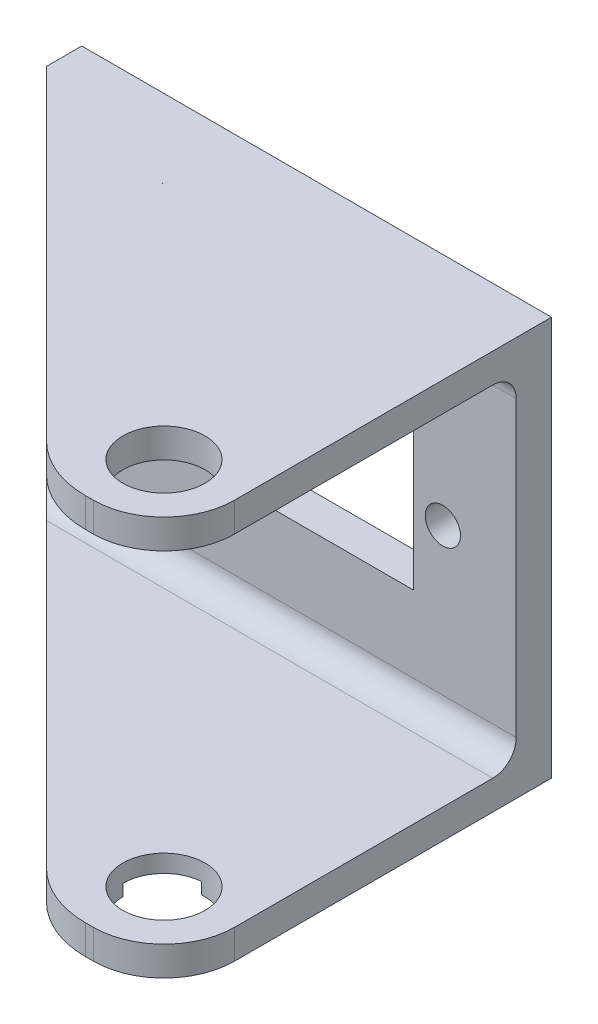
ISO-10303-21;
HEADER;
FILE_DESCRIPTION(('STEP AP214'),'2;1');
FILE_NAME('part.step','',(''),(''),'','','');
FILE_SCHEMA(('AUTOMOTIVE_DESIGN { 1 0 10303 214 1 1 1 1 }'));
ENDSEC;
DATA;
#1=APPLICATION_CONTEXT('core data for automotive mechanical design processes');
#2=APPLICATION_PROTOCOL_DEFINITION('international standard','automotive_design',2000,#1);
#3=PRODUCT_CONTEXT('',#1,'mechanical');
#4=PRODUCT('Part','Part','',(#3));
#5=PRODUCT_RELATED_PRODUCT_CATEGORY('part','',(#4));
#6=PRODUCT_DEFINITION_FORMATION('','',#4);
#7=PRODUCT_DEFINITION_CONTEXT('part definition',#1,'design');
#8=PRODUCT_DEFINITION('design','',#6,#7);
#9=PRODUCT_DEFINITION_SHAPE('','',#8);
#10=(LENGTH_UNIT() NAMED_UNIT(*) SI_UNIT(.MILLI.,.METRE.));
#11=(NAMED_UNIT(*) PLANE_ANGLE_UNIT() SI_UNIT($,.RADIAN.));
#12=(NAMED_UNIT(*) SI_UNIT($,.STERADIAN.) SOLID_ANGLE_UNIT());
#13=UNCERTAINTY_MEASURE_WITH_UNIT(LENGTH_MEASURE(1.E-05),#10,'distance_accuracy_value','');
#14=(GEOMETRIC_REPRESENTATION_CONTEXT(3) GLOBAL_UNCERTAINTY_ASSIGNED_CONTEXT((#13)) GLOBAL_UNIT_ASSIGNED_CONTEXT((#10,
#11,#12)) REPRESENTATION_CONTEXT('',''));
#15=CARTESIAN_POINT('',(0.,0.,0.));
#16=DIRECTION('',(0.,0.,1.));
#17=DIRECTION('',(1.,0.,0.));
#18=AXIS2_PLACEMENT_3D('',#15,#16,#17);
#19=CARTESIAN_POINT('',(0.,0.,3.));
#20=DIRECTION('',(0.,0.,-1.));
#21=DIRECTION('',(-1.,0.,0.));
#22=AXIS2_PLACEMENT_3D('',#19,#20,#21);
#23=PLANE('',#22);
#24=CARTESIAN_POINT('',(11.6483516483516,0.459478021978021,3.));
#25=DIRECTION('',(0.,0.,1.));
#26=DIRECTION('',(1.,0.,0.));
#27=AXIS2_PLACEMENT_3D('',#24,#25,#26);
#28=CIRCLE('',#27,1.5);
#29=CARTESIAN_POINT('',(13.1483516483516,0.459478021978021,3.));
#30=VERTEX_POINT('',#29);
#31=EDGE_CURVE('E349',#30,#30,#28,.T.);
#32=ORIENTED_EDGE('',*,*,#31,.F.);
#33=EDGE_LOOP('',(#32));
#34=FACE_BOUND('',#33,.T.);
#35=CARTESIAN_POINT('',(-15.8516483516484,0.459478021978021,3.));
#36=DIRECTION('',(0.,0.,-1.));
#37=DIRECTION('',(-1.,0.,0.));
#38=AXIS2_PLACEMENT_3D('',#35,#36,#37);
#39=CIRCLE('',#38,1.5);
#40=CARTESIAN_POINT('',(-17.3516483516484,0.459478021978021,3.));
#41=VERTEX_POINT('',#40);
#42=EDGE_CURVE('E355',#41,#41,#39,.T.);
#43=ORIENTED_EDGE('',*,*,#42,.T.);
#44=EDGE_LOOP('',(#43));
#45=FACE_BOUND('',#44,.T.);
#46=DIRECTION('',(1.,0.,0.));
#47=VECTOR('',#46,1.);
#48=CARTESIAN_POINT('',(-13.3516483516484,-5.54052197802198,3.));
#49=LINE('',#48,#47);
#50=CARTESIAN_POINT('',(-13.3516483516484,-5.54052197802198,3.));
#51=VERTEX_POINT('',#50);
#52=CARTESIAN_POINT('',(9.14835164835165,-5.54052197802198,3.));
#53=VERTEX_POINT('',#52);
#54=EDGE_CURVE('E318',#51,#53,#49,.T.);
#55=ORIENTED_EDGE('',*,*,#54,.F.);
#56=DIRECTION('',(0.,-1.,0.));
#57=VECTOR('',#56,1.);
#58=CARTESIAN_POINT('',(-13.3516483516484,6.45947802197802,3.));
#59=LINE('',#58,#57);
#60=CARTESIAN_POINT('',(-13.3516483516484,6.45947802197802,3.));
#61=VERTEX_POINT('',#60);
#62=EDGE_CURVE('E327',#61,#51,#59,.T.);
#63=ORIENTED_EDGE('',*,*,#62,.F.);
#64=DIRECTION('',(1.,0.,0.));
#65=VECTOR('',#64,1.);
#66=CARTESIAN_POINT('',(-13.3516483516484,6.45947802197802,3.));
#67=LINE('',#66,#65);
#68=CARTESIAN_POINT('',(9.14835164835164,6.45947802197802,3.));
#69=VERTEX_POINT('',#68);
#70=EDGE_CURVE('E324',#61,#69,#67,.T.);
#71=ORIENTED_EDGE('',*,*,#70,.T.);
#72=DIRECTION('',(0.,-1.,0.));
#73=VECTOR('',#72,1.);
#74=CARTESIAN_POINT('',(9.14835164835164,6.45947802197802,3.));
#75=LINE('',#74,#73);
#76=EDGE_CURVE('E320',#69,#53,#75,.T.);
#77=ORIENTED_EDGE('',*,*,#76,.T.);
#78=EDGE_LOOP('',(#55,#63,#71,#77));
#79=FACE_BOUND('',#78,.T.);
#80=DIRECTION('',(0.,-1.,0.));
#81=VECTOR('',#80,1.);
#82=CARTESIAN_POINT('',(-22.1016483516484,17.459478021978,3.));
#83=LINE('',#82,#81);
#84=CARTESIAN_POINT('',(-22.1016483516484,12.959478021978,3.));
#85=VERTEX_POINT('',#84);
#86=CARTESIAN_POINT('',(-22.1016483516484,-12.040521978022,3.));
#87=VERTEX_POINT('',#86);
#88=EDGE_CURVE('E364',#85,#87,#83,.T.);
#89=ORIENTED_EDGE('',*,*,#88,.T.);
#90=DIRECTION('',(-1.,0.,0.));
#91=VECTOR('',#90,1.);
#92=CARTESIAN_POINT('',(17.8983516483516,-12.040521978022,3.));
#93=LINE('',#92,#91);
#94=CARTESIAN_POINT('',(17.8983516483516,-12.040521978022,3.));
#95=VERTEX_POINT('',#94);
#96=EDGE_CURVE('E414',#87,#95,#93,.F.);
#97=ORIENTED_EDGE('',*,*,#96,.T.);
#98=DIRECTION('',(0.,-1.,0.));
#99=VECTOR('',#98,1.);
#100=CARTESIAN_POINT('',(17.8983516483516,17.459478021978,3.));
#101=LINE('',#100,#99);
#102=CARTESIAN_POINT('',(17.8983516483516,12.959478021978,3.));
#103=VERTEX_POINT('',#102);
#104=EDGE_CURVE('E361',#103,#95,#101,.T.);
#105=ORIENTED_EDGE('',*,*,#104,.F.);
#106=DIRECTION('',(1.,0.,0.));
#107=VECTOR('',#106,1.);
#108=CARTESIAN_POINT('',(-22.1016483516484,12.959478021978,3.));
#109=LINE('',#108,#107);
#110=EDGE_CURVE('E411',#103,#85,#109,.F.);
#111=ORIENTED_EDGE('',*,*,#110,.T.);
#112=EDGE_LOOP('',(#89,#97,#105,#111));
#113=FACE_BOUND('',#112,.T.);
#114=ADVANCED_FACE('F93',(#34,#45,#79,#113),#23,.F.);
#115=CARTESIAN_POINT('',(0.,0.,0.));
#116=DIRECTION('',(0.,0.,-1.));
#117=DIRECTION('',(-1.,0.,0.));
#118=AXIS2_PLACEMENT_3D('',#115,#116,#117);
#119=PLANE('',#118);
#120=DIRECTION('',(1.,0.,0.));
#121=VECTOR('',#120,1.);
#122=CARTESIAN_POINT('',(-22.1016483516484,-16.540521978022,0.));
#123=LINE('',#122,#121);
#124=CARTESIAN_POINT('',(-22.1016483516484,-16.540521978022,0.));
#125=VERTEX_POINT('',#124);
#126=CARTESIAN_POINT('',(17.8983516483516,-16.540521978022,0.));
#127=VERTEX_POINT('',#126);
#128=EDGE_CURVE('E358',#125,#127,#123,.T.);
#129=ORIENTED_EDGE('',*,*,#128,.F.);
#130=DIRECTION('',(0.,-1.,0.));
#131=VECTOR('',#130,1.);
#132=CARTESIAN_POINT('',(-22.1016483516484,17.459478021978,0.));
#133=LINE('',#132,#131);
#134=CARTESIAN_POINT('',(-22.1016483516484,17.459478021978,0.));
#135=VERTEX_POINT('',#134);
#136=EDGE_CURVE('E365',#135,#125,#133,.T.);
#137=ORIENTED_EDGE('',*,*,#136,.F.);
#138=DIRECTION('',(1.,0.,0.));
#139=VECTOR('',#138,1.);
#140=CARTESIAN_POINT('',(-22.1016483516484,17.459478021978,0.));
#141=LINE('',#140,#139);
#142=CARTESIAN_POINT('',(17.8983516483516,17.459478021978,0.));
#143=VERTEX_POINT('',#142);
#144=EDGE_CURVE('E374',#135,#143,#141,.T.);
#145=ORIENTED_EDGE('',*,*,#144,.T.);
#146=DIRECTION('',(0.,-1.,0.));
#147=VECTOR('',#146,1.);
#148=CARTESIAN_POINT('',(17.8983516483516,17.459478021978,0.));
#149=LINE('',#148,#147);
#150=EDGE_CURVE('E371',#143,#127,#149,.T.);
#151=ORIENTED_EDGE('',*,*,#150,.T.);
#152=EDGE_LOOP('',(#129,#137,#145,#151));
#153=FACE_BOUND('',#152,.T.);
#154=CARTESIAN_POINT('',(-15.8516483516484,0.459478021978021,0.));
#155=DIRECTION('',(0.,0.,-1.));
#156=DIRECTION('',(-1.,0.,0.));
#157=AXIS2_PLACEMENT_3D('',#154,#155,#156);
#158=CIRCLE('',#157,1.5);
#159=CARTESIAN_POINT('',(-17.3516483516484,0.459478021978021,0.));
#160=VERTEX_POINT('',#159);
#161=EDGE_CURVE('E352',#160,#160,#158,.T.);
#162=ORIENTED_EDGE('',*,*,#161,.F.);
#163=EDGE_LOOP('',(#162));
#164=FACE_BOUND('',#163,.T.);
#165=CARTESIAN_POINT('',(11.6483516483516,0.459478021978021,0.));
#166=DIRECTION('',(0.,0.,1.));
#167=DIRECTION('',(1.,0.,0.));
#168=AXIS2_PLACEMENT_3D('',#165,#166,#167);
#169=CIRCLE('',#168,1.5);
#170=CARTESIAN_POINT('',(13.1483516483516,0.459478021978021,0.));
#171=VERTEX_POINT('',#170);
#172=EDGE_CURVE('E348',#171,#171,#169,.T.);
#173=ORIENTED_EDGE('',*,*,#172,.T.);
#174=EDGE_LOOP('',(#173));
#175=FACE_BOUND('',#174,.T.);
#176=DIRECTION('',(0.,-1.,0.));
#177=VECTOR('',#176,1.);
#178=CARTESIAN_POINT('',(-13.3516483516484,6.45947802197802,0.));
#179=LINE('',#178,#177);
#180=CARTESIAN_POINT('',(-13.3516483516484,6.45947802197802,0.));
#181=VERTEX_POINT('',#180);
#182=CARTESIAN_POINT('',(-13.3516483516484,-5.54052197802198,0.));
#183=VERTEX_POINT('',#182);
#184=EDGE_CURVE('E321',#181,#183,#179,.T.);
#185=ORIENTED_EDGE('',*,*,#184,.T.);
#186=DIRECTION('',(1.,0.,0.));
#187=VECTOR('',#186,1.);
#188=CARTESIAN_POINT('',(-13.3516483516484,-5.54052197802198,0.));
#189=LINE('',#188,#187);
#190=CARTESIAN_POINT('',(9.14835164835165,-5.54052197802198,0.));
#191=VERTEX_POINT('',#190);
#192=EDGE_CURVE('E317',#183,#191,#189,.T.);
#193=ORIENTED_EDGE('',*,*,#192,.T.);
#194=DIRECTION('',(0.,-1.,0.));
#195=VECTOR('',#194,1.);
#196=CARTESIAN_POINT('',(9.14835164835164,6.45947802197802,0.));
#197=LINE('',#196,#195);
#198=CARTESIAN_POINT('',(9.14835164835164,6.45947802197802,0.));
#199=VERTEX_POINT('',#198);
#200=EDGE_CURVE('E332',#199,#191,#197,.T.);
#201=ORIENTED_EDGE('',*,*,#200,.F.);
#202=DIRECTION('',(1.,0.,0.));
#203=VECTOR('',#202,1.);
#204=CARTESIAN_POINT('',(-13.3516483516484,6.45947802197802,0.));
#205=LINE('',#204,#203);
#206=EDGE_CURVE('E335',#181,#199,#205,.T.);
#207=ORIENTED_EDGE('',*,*,#206,.F.);
#208=EDGE_LOOP('',(#185,#193,#201,#207));
#209=FACE_BOUND('',#208,.T.);
#210=ADVANCED_FACE('F464',(#153,#164,#175,#209),#119,.T.);
#211=CARTESIAN_POINT('',(-22.1016483516484,-16.540521978022,3.));
#212=DIRECTION('',(0.,1.,0.));
#213=DIRECTION('',(-1.,0.,0.));
#214=AXIS2_PLACEMENT_3D('',#211,#212,#213);
#215=PLANE('',#214);
#216=CARTESIAN_POINT('',(11.8983516483516,-16.540521978022,27.));
#217=DIRECTION('',(0.,1.,0.));
#218=DIRECTION('',(-1.,0.,0.));
#219=AXIS2_PLACEMENT_3D('',#216,#217,#218);
#220=CIRCLE('',#219,3.5);
#221=CARTESIAN_POINT('',(8.39835164835164,-16.540521978022,27.));
#222=VERTEX_POINT('',#221);
#223=CARTESIAN_POINT('',(11.6215659340659,-16.540521978022,23.5109614980102));
#224=VERTEX_POINT('',#223);
#225=EDGE_CURVE('E273',#222,#224,#220,.T.);
#226=ORIENTED_EDGE('',*,*,#225,.T.);
#227=DIRECTION('',(0.703749766299696,0.,0.710447933653919));
#228=VECTOR('',#227,1.);
#229=CARTESIAN_POINT('',(1.21341928070236,-16.540521978022,13.0037519227531));
#230=LINE('',#229,#228);
#231=CARTESIAN_POINT('',(1.21341928070236,-16.540521978022,13.0037519227531));
#232=VERTEX_POINT('',#231);
#233=EDGE_CURVE('E268',#232,#224,#230,.T.);
#234=ORIENTED_EDGE('',*,*,#233,.F.);
#235=DIRECTION('',(0.710447933653919,0.,-0.703749766299696));
#236=VECTOR('',#235,1.);
#237=CARTESIAN_POINT('',(-2.1578948461438,-16.540521978022,16.3432809951912));
#238=LINE('',#237,#236);
#239=CARTESIAN_POINT('',(-2.1578948461438,-16.540521978022,16.3432809951912));
#240=VERTEX_POINT('',#239);
#241=EDGE_CURVE('E769',#240,#232,#238,.T.);
#242=ORIENTED_EDGE('',*,*,#241,.F.);
#243=DIRECTION('',(-0.703749766299696,0.,-0.710447933653919));
#244=VECTOR('',#243,1.);
#245=CARTESIAN_POINT('',(8.39835164835164,-16.540521978022,27.));
#246=LINE('',#245,#244);
#247=EDGE_CURVE('E772',#222,#240,#246,.T.);
#248=ORIENTED_EDGE('',*,*,#247,.F.);
#249=EDGE_LOOP('',(#226,#234,#242,#248));
#250=FACE_BOUND('',#249,.T.);
#251=DIRECTION('',(1.,0.,0.));
#252=VECTOR('',#251,1.);
#253=CARTESIAN_POINT('',(17.8983516483516,-16.540521978022,33.));
#254=LINE('',#253,#252);
#255=CARTESIAN_POINT('',(11.2120601473364,-16.540521978022,33.));
#256=VERTEX_POINT('',#255);
#257=CARTESIAN_POINT('',(11.8983516483516,-16.540521978022,33.));
#258=VERTEX_POINT('',#257);
#259=EDGE_CURVE('E304',#256,#258,#254,.T.);
#260=ORIENTED_EDGE('',*,*,#259,.F.);
#261=CARTESIAN_POINT('',(11.2120601473364,-16.540521978022,25.));
#262=DIRECTION('',(0.,1.,0.));
#263=DIRECTION('',(-1.,0.,0.));
#264=AXIS2_PLACEMENT_3D('',#261,#262,#263);
#265=CIRCLE('',#264,8.);
#266=CARTESIAN_POINT('',(5.55520589784404,-16.540521978022,30.6568542494924));
#267=VERTEX_POINT('',#266);
#268=EDGE_CURVE('E430',#256,#267,#265,.F.);
#269=ORIENTED_EDGE('',*,*,#268,.T.);
#270=DIRECTION('',(-0.707106781186548,0.,-0.707106781186548));
#271=VECTOR('',#270,1.);
#272=CARTESIAN_POINT('',(-22.1016483516484,-16.540521978022,3.));
#273=LINE('',#272,#271);
#274=CARTESIAN_POINT('',(-22.1016483516484,-16.540521978022,3.));
#275=VERTEX_POINT('',#274);
#276=EDGE_CURVE('E294',#267,#275,#273,.T.);
#277=ORIENTED_EDGE('',*,*,#276,.T.);
#278=DIRECTION('',(0.,0.,-1.));
#279=VECTOR('',#278,1.);
#280=CARTESIAN_POINT('',(-22.1016483516484,-16.540521978022,3.));
#281=LINE('',#280,#279);
#282=EDGE_CURVE('E368',#275,#125,#281,.T.);
#283=ORIENTED_EDGE('',*,*,#282,.T.);
#284=ORIENTED_EDGE('',*,*,#128,.T.);
#285=DIRECTION('',(0.,0.,-1.));
#286=VECTOR('',#285,1.);
#287=CARTESIAN_POINT('',(17.8983516483516,-16.540521978022,3.));
#288=LINE('',#287,#286);
#289=CARTESIAN_POINT('',(17.8983516483516,-16.540521978022,27.));
#290=VERTEX_POINT('',#289);
#291=EDGE_CURVE('E384',#290,#127,#288,.T.);
#292=ORIENTED_EDGE('',*,*,#291,.F.);
#293=CARTESIAN_POINT('',(11.8983516483516,-16.540521978022,27.));
#294=DIRECTION('',(0.,1.,0.));
#295=DIRECTION('',(-1.,0.,0.));
#296=AXIS2_PLACEMENT_3D('',#293,#294,#295);
#297=CIRCLE('',#296,6.);
#298=EDGE_CURVE('E405',#290,#258,#297,.F.);
#299=ORIENTED_EDGE('',*,*,#298,.T.);
#300=EDGE_LOOP('',(#260,#269,#277,#283,#284,#292,#299));
#301=FACE_BOUND('',#300,.T.);
#302=ADVANCED_FACE('F470',(#250,#301),#215,.F.);
#303=CARTESIAN_POINT('',(17.8983516483516,17.459478021978,3.));
#304=DIRECTION('',(1.,0.,0.));
#305=DIRECTION('',(0.,1.,0.));
#306=AXIS2_PLACEMENT_3D('',#303,#304,#305);
#307=PLANE('',#306);
#308=DIRECTION('',(0.,0.,-1.));
#309=VECTOR('',#308,1.);
#310=CARTESIAN_POINT('',(17.8983516483516,17.459478021978,3.));
#311=LINE('',#310,#309);
#312=CARTESIAN_POINT('',(17.8983516483516,17.459478021978,27.));
#313=VERTEX_POINT('',#312);
#314=EDGE_CURVE('E382',#313,#143,#311,.T.);
#315=ORIENTED_EDGE('',*,*,#314,.F.);
#316=DIRECTION('',(0.,1.,0.));
#317=VECTOR('',#316,1.);
#318=CARTESIAN_POINT('',(17.8983516483516,17.459478021978,27.));
#319=LINE('',#318,#317);
#320=CARTESIAN_POINT('',(17.8983516483516,14.959478021978,27.));
#321=VERTEX_POINT('',#320);
#322=EDGE_CURVE('E395',#313,#321,#319,.F.);
#323=ORIENTED_EDGE('',*,*,#322,.T.);
#324=DIRECTION('',(0.,0.,-1.));
#325=VECTOR('',#324,1.);
#326=CARTESIAN_POINT('',(17.8983516483516,14.959478021978,33.));
#327=LINE('',#326,#325);
#328=CARTESIAN_POINT('',(17.8983516483516,14.959478021978,5.));
#329=VERTEX_POINT('',#328);
#330=EDGE_CURVE('E314',#321,#329,#327,.T.);
#331=ORIENTED_EDGE('',*,*,#330,.T.);
#332=CARTESIAN_POINT('',(17.8983516483516,12.959478021978,5.));
#333=DIRECTION('',(1.,0.,0.));
#334=DIRECTION('',(0.,1.,0.));
#335=AXIS2_PLACEMENT_3D('',#332,#333,#334);
#336=CIRCLE('',#335,2.);
#337=EDGE_CURVE('E424',#329,#103,#336,.F.);
#338=ORIENTED_EDGE('',*,*,#337,.T.);
#339=ORIENTED_EDGE('',*,*,#104,.T.);
#340=CARTESIAN_POINT('',(17.8983516483516,-12.040521978022,5.));
#341=DIRECTION('',(1.,0.,0.));
#342=DIRECTION('',(0.,1.,0.));
#343=AXIS2_PLACEMENT_3D('',#340,#341,#342);
#344=CIRCLE('',#343,2.);
#345=CARTESIAN_POINT('',(17.8983516483516,-14.040521978022,5.));
#346=VERTEX_POINT('',#345);
#347=EDGE_CURVE('E422',#95,#346,#344,.F.);
#348=ORIENTED_EDGE('',*,*,#347,.T.);
#349=DIRECTION('',(0.,0.,-1.));
#350=VECTOR('',#349,1.);
#351=CARTESIAN_POINT('',(17.8983516483516,-14.040521978022,33.));
#352=LINE('',#351,#350);
#353=CARTESIAN_POINT('',(17.8983516483516,-14.040521978022,27.));
#354=VERTEX_POINT('',#353);
#355=EDGE_CURVE('E306',#354,#346,#352,.T.);
#356=ORIENTED_EDGE('',*,*,#355,.F.);
#357=DIRECTION('',(0.,1.,0.));
#358=VECTOR('',#357,1.);
#359=CARTESIAN_POINT('',(17.8983516483516,-16.540521978022,27.));
#360=LINE('',#359,#358);
#361=EDGE_CURVE('E393',#354,#290,#360,.F.);
#362=ORIENTED_EDGE('',*,*,#361,.T.);
#363=ORIENTED_EDGE('',*,*,#291,.T.);
#364=ORIENTED_EDGE('',*,*,#150,.F.);
#365=EDGE_LOOP('',(#315,#323,#331,#338,#339,#348,#356,#362,#363,#364));
#366=FACE_BOUND('',#365,.T.);
#367=ADVANCED_FACE('F485',(#366),#307,.T.);
#368=CARTESIAN_POINT('',(-22.1016483516484,17.459478021978,3.));
#369=DIRECTION('',(0.,1.,0.));
#370=DIRECTION('',(-1.,0.,0.));
#371=AXIS2_PLACEMENT_3D('',#368,#369,#370);
#372=PLANE('',#371);
#373=DIRECTION('',(0.707106781186547,0.,0.707106781186547));
#374=VECTOR('',#373,1.);
#375=CARTESIAN_POINT('',(-22.1016483516484,17.459478021978,3.));
#376=LINE('',#375,#374);
#377=CARTESIAN_POINT('',(-22.1016483516484,17.459478021978,3.));
#378=VERTEX_POINT('',#377);
#379=CARTESIAN_POINT('',(5.55520589784402,17.459478021978,30.6568542494924));
#380=VERTEX_POINT('',#379);
#381=EDGE_CURVE('E280',#378,#380,#376,.T.);
#382=ORIENTED_EDGE('',*,*,#381,.T.);
#383=CARTESIAN_POINT('',(11.2120601473364,17.459478021978,25.));
#384=DIRECTION('',(0.,1.,0.));
#385=DIRECTION('',(-1.,0.,0.));
#386=AXIS2_PLACEMENT_3D('',#383,#384,#385);
#387=CIRCLE('',#386,8.);
#388=CARTESIAN_POINT('',(11.2120601473364,17.459478021978,33.));
#389=VERTEX_POINT('',#388);
#390=EDGE_CURVE('E12',#380,#389,#387,.T.);
#391=ORIENTED_EDGE('',*,*,#390,.T.);
#392=DIRECTION('',(-1.,0.,0.));
#393=VECTOR('',#392,1.);
#394=CARTESIAN_POINT('',(17.8983516483516,17.459478021978,33.));
#395=LINE('',#394,#393);
#396=CARTESIAN_POINT('',(11.8983516483516,17.459478021978,33.));
#397=VERTEX_POINT('',#396);
#398=EDGE_CURVE('E311',#397,#389,#395,.T.);
#399=ORIENTED_EDGE('',*,*,#398,.F.);
#400=CARTESIAN_POINT('',(11.8983516483516,17.459478021978,27.));
#401=DIRECTION('',(0.,1.,0.));
#402=DIRECTION('',(-1.,0.,0.));
#403=AXIS2_PLACEMENT_3D('',#400,#401,#402);
#404=CIRCLE('',#403,6.);
#405=EDGE_CURVE('E391',#397,#313,#404,.T.);
#406=ORIENTED_EDGE('',*,*,#405,.T.);
#407=ORIENTED_EDGE('',*,*,#314,.T.);
#408=ORIENTED_EDGE('',*,*,#144,.F.);
#409=DIRECTION('',(0.,0.,-1.));
#410=VECTOR('',#409,1.);
#411=CARTESIAN_POINT('',(-22.1016483516484,17.459478021978,3.));
#412=LINE('',#411,#410);
#413=EDGE_CURVE('E380',#378,#135,#412,.T.);
#414=ORIENTED_EDGE('',*,*,#413,.F.);
#415=EDGE_LOOP('',(#382,#391,#399,#406,#407,#408,#414));
#416=FACE_BOUND('',#415,.T.);
#417=CARTESIAN_POINT('',(11.8983516483516,17.459478021978,27.));
#418=DIRECTION('',(0.,-1.,0.));
#419=DIRECTION('',(1.,0.,0.));
#420=AXIS2_PLACEMENT_3D('',#417,#418,#419);
#421=CIRCLE('',#420,3.5);
#422=CARTESIAN_POINT('',(15.3983516483516,17.459478021978,27.));
#423=VERTEX_POINT('',#422);
#424=EDGE_CURVE('E283',#423,#423,#421,.T.);
#425=ORIENTED_EDGE('',*,*,#424,.T.);
#426=EDGE_LOOP('',(#425));
#427=FACE_BOUND('',#426,.T.);
#428=ADVANCED_FACE('F453',(#416,#427),#372,.T.);
#429=CARTESIAN_POINT('',(-22.1016483516484,17.459478021978,3.));
#430=DIRECTION('',(1.,0.,0.));
#431=DIRECTION('',(0.,1.,0.));
#432=AXIS2_PLACEMENT_3D('',#429,#430,#431);
#433=PLANE('',#432);
#434=ORIENTED_EDGE('',*,*,#282,.F.);
#435=DIRECTION('',(0.,-1.,0.));
#436=VECTOR('',#435,1.);
#437=CARTESIAN_POINT('',(-22.1016483516484,17.459478021978,3.));
#438=LINE('',#437,#436);
#439=EDGE_CURVE('E282',#87,#275,#438,.T.);
#440=ORIENTED_EDGE('',*,*,#439,.F.);
#441=ORIENTED_EDGE('',*,*,#88,.F.);
#442=EDGE_CURVE('E284',#378,#85,#438,.T.);
#443=ORIENTED_EDGE('',*,*,#442,.F.);
#444=ORIENTED_EDGE('',*,*,#413,.T.);
#445=ORIENTED_EDGE('',*,*,#136,.T.);
#446=EDGE_LOOP('',(#434,#440,#441,#443,#444,#445));
#447=FACE_BOUND('',#446,.T.);
#448=ADVANCED_FACE('F479',(#447),#433,.F.);
#449=CARTESIAN_POINT('',(-15.8516483516484,0.459478021978021,3.));
#450=DIRECTION('',(0.,0.,-1.));
#451=DIRECTION('',(-1.,0.,0.));
#452=AXIS2_PLACEMENT_3D('',#449,#450,#451);
#453=CYLINDRICAL_SURFACE('',#452,1.5);
#454=ORIENTED_EDGE('',*,*,#42,.F.);
#455=EDGE_LOOP('',(#454));
#456=FACE_BOUND('',#455,.T.);
#457=ORIENTED_EDGE('',*,*,#161,.T.);
#458=EDGE_LOOP('',(#457));
#459=FACE_BOUND('',#458,.T.);
#460=ADVANCED_FACE('F476',(#456,#459),#453,.F.);
#461=CARTESIAN_POINT('',(11.6483516483516,0.459478021978021,3.));
#462=DIRECTION('',(0.,0.,-1.));
#463=DIRECTION('',(-1.,0.,0.));
#464=AXIS2_PLACEMENT_3D('',#461,#462,#463);
#465=CYLINDRICAL_SURFACE('',#464,1.5);
#466=ORIENTED_EDGE('',*,*,#31,.T.);
#467=EDGE_LOOP('',(#466));
#468=FACE_BOUND('',#467,.T.);
#469=ORIENTED_EDGE('',*,*,#172,.F.);
#470=EDGE_LOOP('',(#469));
#471=FACE_BOUND('',#470,.T.);
#472=ADVANCED_FACE('F576',(#468,#471),#465,.F.);
#473=CARTESIAN_POINT('',(-13.3516483516484,-5.54052197802198,3.));
#474=DIRECTION('',(0.,1.,0.));
#475=DIRECTION('',(0.,0.,1.));
#476=AXIS2_PLACEMENT_3D('',#473,#474,#475);
#477=PLANE('',#476);
#478=ORIENTED_EDGE('',*,*,#192,.F.);
#479=DIRECTION('',(0.,0.,-1.));
#480=VECTOR('',#479,1.);
#481=CARTESIAN_POINT('',(-13.3516483516484,-5.54052197802198,3.));
#482=LINE('',#481,#480);
#483=EDGE_CURVE('E329',#51,#183,#482,.T.);
#484=ORIENTED_EDGE('',*,*,#483,.F.);
#485=ORIENTED_EDGE('',*,*,#54,.T.);
#486=DIRECTION('',(0.,0.,-1.));
#487=VECTOR('',#486,1.);
#488=CARTESIAN_POINT('',(9.14835164835165,-5.54052197802198,3.));
#489=LINE('',#488,#487);
#490=EDGE_CURVE('E346',#53,#191,#489,.T.);
#491=ORIENTED_EDGE('',*,*,#490,.T.);
#492=EDGE_LOOP('',(#478,#484,#485,#491));
#493=FACE_BOUND('',#492,.T.);
#494=ADVANCED_FACE('F573',(#493),#477,.T.);
#495=CARTESIAN_POINT('',(9.14835164835164,6.45947802197802,3.));
#496=DIRECTION('',(1.,0.,0.));
#497=DIRECTION('',(0.,1.,0.));
#498=AXIS2_PLACEMENT_3D('',#495,#496,#497);
#499=PLANE('',#498);
#500=ORIENTED_EDGE('',*,*,#200,.T.);
#501=ORIENTED_EDGE('',*,*,#490,.F.);
#502=ORIENTED_EDGE('',*,*,#76,.F.);
#503=DIRECTION('',(0.,0.,-1.));
#504=VECTOR('',#503,1.);
#505=CARTESIAN_POINT('',(9.14835164835164,6.45947802197802,3.));
#506=LINE('',#505,#504);
#507=EDGE_CURVE('E344',#69,#199,#506,.T.);
#508=ORIENTED_EDGE('',*,*,#507,.T.);
#509=EDGE_LOOP('',(#500,#501,#502,#508));
#510=FACE_BOUND('',#509,.T.);
#511=ADVANCED_FACE('F569',(#510),#499,.F.);
#512=CARTESIAN_POINT('',(-13.3516483516484,6.45947802197802,3.));
#513=DIRECTION('',(0.,1.,0.));
#514=DIRECTION('',(0.,0.,1.));
#515=AXIS2_PLACEMENT_3D('',#512,#513,#514);
#516=PLANE('',#515);
#517=ORIENTED_EDGE('',*,*,#206,.T.);
#518=ORIENTED_EDGE('',*,*,#507,.F.);
#519=ORIENTED_EDGE('',*,*,#70,.F.);
#520=DIRECTION('',(0.,0.,-1.));
#521=VECTOR('',#520,1.);
#522=CARTESIAN_POINT('',(-13.3516483516484,6.45947802197802,3.));
#523=LINE('',#522,#521);
#524=EDGE_CURVE('E342',#61,#181,#523,.T.);
#525=ORIENTED_EDGE('',*,*,#524,.T.);
#526=EDGE_LOOP('',(#517,#518,#519,#525));
#527=FACE_BOUND('',#526,.T.);
#528=ADVANCED_FACE('F565',(#527),#516,.F.);
#529=CARTESIAN_POINT('',(-13.3516483516484,6.45947802197802,3.));
#530=DIRECTION('',(1.,0.,0.));
#531=DIRECTION('',(0.,0.,-1.));
#532=AXIS2_PLACEMENT_3D('',#529,#530,#531);
#533=PLANE('',#532);
#534=ORIENTED_EDGE('',*,*,#184,.F.);
#535=ORIENTED_EDGE('',*,*,#524,.F.);
#536=ORIENTED_EDGE('',*,*,#62,.T.);
#537=ORIENTED_EDGE('',*,*,#483,.T.);
#538=EDGE_LOOP('',(#534,#535,#536,#537));
#539=FACE_BOUND('',#538,.T.);
#540=ADVANCED_FACE('F561',(#539),#533,.T.);
#541=CARTESIAN_POINT('',(-22.1016483516484,14.959478021978,33.));
#542=DIRECTION('',(0.,1.,0.));
#543=DIRECTION('',(0.,0.,1.));
#544=AXIS2_PLACEMENT_3D('',#541,#542,#543);
#545=PLANE('',#544);
#546=CARTESIAN_POINT('',(11.8983516483516,14.959478021978,27.));
#547=DIRECTION('',(0.,1.,0.));
#548=DIRECTION('',(0.,0.,1.));
#549=AXIS2_PLACEMENT_3D('',#546,#547,#548);
#550=CIRCLE('',#549,3.5);
#551=CARTESIAN_POINT('',(11.8983516483516,14.959478021978,30.5));
#552=VERTEX_POINT('',#551);
#553=EDGE_CURVE('E297',#552,#552,#550,.T.);
#554=ORIENTED_EDGE('',*,*,#553,.T.);
#555=EDGE_LOOP('',(#554));
#556=FACE_BOUND('',#555,.T.);
#557=DIRECTION('',(1.,0.,0.));
#558=VECTOR('',#557,1.);
#559=CARTESIAN_POINT('',(-22.1016483516484,14.959478021978,33.));
#560=LINE('',#559,#558);
#561=CARTESIAN_POINT('',(11.2120601473364,14.959478021978,33.));
#562=VERTEX_POINT('',#561);
#563=CARTESIAN_POINT('',(11.8983516483516,14.959478021978,33.));
#564=VERTEX_POINT('',#563);
#565=EDGE_CURVE('E309',#562,#564,#560,.T.);
#566=ORIENTED_EDGE('',*,*,#565,.F.);
#567=CARTESIAN_POINT('',(11.2120601473364,14.959478021978,25.));
#568=DIRECTION('',(0.,1.,0.));
#569=DIRECTION('',(0.,0.,1.));
#570=AXIS2_PLACEMENT_3D('',#567,#568,#569);
#571=CIRCLE('',#570,8.);
#572=CARTESIAN_POINT('',(5.55520589784402,14.959478021978,30.6568542494924));
#573=VERTEX_POINT('',#572);
#574=EDGE_CURVE('E115',#562,#573,#571,.F.);
#575=ORIENTED_EDGE('',*,*,#574,.T.);
#576=DIRECTION('',(-0.707106781186548,0.,-0.707106781186548));
#577=VECTOR('',#576,1.);
#578=CARTESIAN_POINT('',(-7.10164835164836,14.959478021978,18.));
#579=LINE('',#578,#577);
#580=CARTESIAN_POINT('',(-20.1016483516484,14.959478021978,5.));
#581=VERTEX_POINT('',#580);
#582=EDGE_CURVE('E292',#573,#581,#579,.T.);
#583=ORIENTED_EDGE('',*,*,#582,.T.);
#584=DIRECTION('',(1.,0.,0.));
#585=VECTOR('',#584,1.);
#586=CARTESIAN_POINT('',(17.8983516483516,14.959478021978,5.));
#587=LINE('',#586,#585);
#588=EDGE_CURVE('E416',#581,#329,#587,.T.);
#589=ORIENTED_EDGE('',*,*,#588,.T.);
#590=ORIENTED_EDGE('',*,*,#330,.F.);
#591=CARTESIAN_POINT('',(11.8983516483516,14.959478021978,27.));
#592=DIRECTION('',(0.,1.,0.));
#593=DIRECTION('',(0.,0.,1.));
#594=AXIS2_PLACEMENT_3D('',#591,#592,#593);
#595=CIRCLE('',#594,6.);
#596=EDGE_CURVE('E397',#321,#564,#595,.F.);
#597=ORIENTED_EDGE('',*,*,#596,.T.);
#598=EDGE_LOOP('',(#566,#575,#583,#589,#590,#597));
#599=FACE_BOUND('',#598,.T.);
#600=ADVANCED_FACE('F445',(#556,#599),#545,.F.);
#601=CARTESIAN_POINT('',(0.,0.,33.));
#602=DIRECTION('',(0.,0.,1.));
#603=DIRECTION('',(1.,0.,0.));
#604=AXIS2_PLACEMENT_3D('',#601,#602,#603);
#605=PLANE('',#604);
#606=ORIENTED_EDGE('',*,*,#398,.T.);
#607=DIRECTION('',(0.,-1.,0.));
#608=VECTOR('',#607,1.);
#609=CARTESIAN_POINT('',(11.2120601473364,14.959478021978,33.));
#610=LINE('',#609,#608);
#611=EDGE_CURVE('E436',#389,#562,#610,.T.);
#612=ORIENTED_EDGE('',*,*,#611,.T.);
#613=ORIENTED_EDGE('',*,*,#565,.T.);
#614=DIRECTION('',(0.,1.,0.));
#615=VECTOR('',#614,1.);
#616=CARTESIAN_POINT('',(11.8983516483516,0.,33.));
#617=LINE('',#616,#615);
#618=EDGE_CURVE('E386',#564,#397,#617,.T.);
#619=ORIENTED_EDGE('',*,*,#618,.T.);
#620=EDGE_LOOP('',(#606,#612,#613,#619));
#621=FACE_BOUND('',#620,.T.);
#622=ADVANCED_FACE('F441',(#621),#605,.T.);
#623=CARTESIAN_POINT('',(-22.1016483516484,-14.040521978022,33.));
#624=DIRECTION('',(0.,-1.,0.));
#625=DIRECTION('',(0.,0.,-1.));
#626=AXIS2_PLACEMENT_3D('',#623,#624,#625);
#627=PLANE('',#626);
#628=CARTESIAN_POINT('',(11.8983516483516,-14.040521978022,27.));
#629=DIRECTION('',(0.,-1.,0.));
#630=DIRECTION('',(0.,0.,-1.));
#631=AXIS2_PLACEMENT_3D('',#628,#629,#630);
#632=CIRCLE('',#631,3.5);
#633=CARTESIAN_POINT('',(11.8983516483516,-14.040521978022,23.5));
#634=VERTEX_POINT('',#633);
#635=EDGE_CURVE('E296',#634,#634,#632,.T.);
#636=ORIENTED_EDGE('',*,*,#635,.T.);
#637=EDGE_LOOP('',(#636));
#638=FACE_BOUND('',#637,.T.);
#639=DIRECTION('',(0.707106781186548,0.,0.707106781186548));
#640=VECTOR('',#639,1.);
#641=CARTESIAN_POINT('',(-7.10164835164836,-14.040521978022,18.));
#642=LINE('',#641,#640);
#643=CARTESIAN_POINT('',(-20.1016483516484,-14.040521978022,5.));
#644=VERTEX_POINT('',#643);
#645=CARTESIAN_POINT('',(5.55520589784402,-14.040521978022,30.6568542494924));
#646=VERTEX_POINT('',#645);
#647=EDGE_CURVE('E286',#644,#646,#642,.T.);
#648=ORIENTED_EDGE('',*,*,#647,.T.);
#649=CARTESIAN_POINT('',(11.2120601473364,-14.040521978022,25.));
#650=DIRECTION('',(0.,-1.,0.));
#651=DIRECTION('',(0.,0.,-1.));
#652=AXIS2_PLACEMENT_3D('',#649,#650,#651);
#653=CIRCLE('',#652,8.);
#654=CARTESIAN_POINT('',(11.2120601473364,-14.040521978022,33.));
#655=VERTEX_POINT('',#654);
#656=EDGE_CURVE('E434',#646,#655,#653,.F.);
#657=ORIENTED_EDGE('',*,*,#656,.T.);
#658=DIRECTION('',(-1.,0.,0.));
#659=VECTOR('',#658,1.);
#660=CARTESIAN_POINT('',(-22.1016483516484,-14.040521978022,33.));
#661=LINE('',#660,#659);
#662=CARTESIAN_POINT('',(11.8983516483517,-14.040521978022,33.));
#663=VERTEX_POINT('',#662);
#664=EDGE_CURVE('E301',#663,#655,#661,.T.);
#665=ORIENTED_EDGE('',*,*,#664,.F.);
#666=CARTESIAN_POINT('',(11.8983516483516,-14.040521978022,27.));
#667=DIRECTION('',(0.,-1.,0.));
#668=DIRECTION('',(0.,0.,-1.));
#669=AXIS2_PLACEMENT_3D('',#666,#667,#668);
#670=CIRCLE('',#669,6.);
#671=EDGE_CURVE('E403',#663,#354,#670,.F.);
#672=ORIENTED_EDGE('',*,*,#671,.T.);
#673=ORIENTED_EDGE('',*,*,#355,.T.);
#674=DIRECTION('',(-1.,0.,0.));
#675=VECTOR('',#674,1.);
#676=CARTESIAN_POINT('',(-22.1016483516484,-14.040521978022,5.));
#677=LINE('',#676,#675);
#678=EDGE_CURVE('E408',#346,#644,#677,.T.);
#679=ORIENTED_EDGE('',*,*,#678,.T.);
#680=EDGE_LOOP('',(#648,#657,#665,#672,#673,#679));
#681=FACE_BOUND('',#680,.T.);
#682=ADVANCED_FACE('F546',(#638,#681),#627,.F.);
#683=CARTESIAN_POINT('',(0.,0.,33.));
#684=DIRECTION('',(0.,0.,-1.));
#685=DIRECTION('',(-1.,0.,0.));
#686=AXIS2_PLACEMENT_3D('',#683,#684,#685);
#687=PLANE('',#686);
#688=ORIENTED_EDGE('',*,*,#664,.T.);
#689=DIRECTION('',(0.,-1.,0.));
#690=VECTOR('',#689,1.);
#691=CARTESIAN_POINT('',(11.2120601473364,0.,33.));
#692=LINE('',#691,#690);
#693=EDGE_CURVE('E257',#655,#256,#692,.T.);
#694=ORIENTED_EDGE('',*,*,#693,.T.);
#695=ORIENTED_EDGE('',*,*,#259,.T.);
#696=DIRECTION('',(0.,1.,0.));
#697=VECTOR('',#696,1.);
#698=CARTESIAN_POINT('',(11.8983516483516,-14.040521978022,33.));
#699=LINE('',#698,#697);
#700=EDGE_CURVE('E400',#258,#663,#699,.T.);
#701=ORIENTED_EDGE('',*,*,#700,.T.);
#702=EDGE_LOOP('',(#688,#694,#695,#701));
#703=FACE_BOUND('',#702,.T.);
#704=ADVANCED_FACE('F542',(#703),#687,.F.);
#705=CARTESIAN_POINT('',(-22.1016483516484,17.459478021978,3.));
#706=DIRECTION('',(0.707106781186547,0.,-0.707106781186547));
#707=DIRECTION('',(-0.707106781186548,0.,-0.707106781186548));
#708=AXIS2_PLACEMENT_3D('',#705,#706,#707);
#709=PLANE('',#708);
#710=ORIENTED_EDGE('',*,*,#276,.F.);
#711=DIRECTION('',(0.,-1.,0.));
#712=VECTOR('',#711,1.);
#713=CARTESIAN_POINT('',(5.55520589784402,17.459478021978,30.6568542494924));
#714=LINE('',#713,#712);
#715=EDGE_CURVE('E432',#267,#646,#714,.F.);
#716=ORIENTED_EDGE('',*,*,#715,.T.);
#717=ORIENTED_EDGE('',*,*,#647,.F.);
#718=CARTESIAN_POINT('',(-20.1016483516484,-12.040521978022,5.));
#719=DIRECTION('',(0.707106781186547,0.,-0.707106781186547));
#720=DIRECTION('',(0.707106781186548,0.,0.707106781186548));
#721=AXIS2_PLACEMENT_3D('',#718,#719,#720);
#722=ELLIPSE('',#721,2.82842712474619,2.);
#723=EDGE_CURVE('E419',#644,#87,#722,.T.);
#724=ORIENTED_EDGE('',*,*,#723,.T.);
#725=ORIENTED_EDGE('',*,*,#439,.T.);
#726=EDGE_LOOP('',(#710,#716,#717,#724,#725));
#727=FACE_BOUND('',#726,.T.);
#728=ADVANCED_FACE('F523',(#727),#709,.F.);
#729=CARTESIAN_POINT('',(11.8983516483516,17.459478021978,27.));
#730=DIRECTION('',(0.,-1.,0.));
#731=DIRECTION('',(1.,0.,0.));
#732=AXIS2_PLACEMENT_3D('',#729,#730,#731);
#733=CYLINDRICAL_SURFACE('',#732,3.5);
#734=ORIENTED_EDGE('',*,*,#635,.F.);
#735=EDGE_LOOP('',(#734));
#736=FACE_BOUND('',#735,.T.);
#737=CARTESIAN_POINT('',(11.8983516483516,-15.540521978022,27.));
#738=DIRECTION('',(0.,-1.,0.));
#739=DIRECTION('',(1.,0.,0.));
#740=AXIS2_PLACEMENT_3D('',#737,#738,#739);
#741=CIRCLE('',#740,3.5);
#742=CARTESIAN_POINT('',(11.6215659340659,-15.540521978022,23.5109614980102));
#743=VERTEX_POINT('',#742);
#744=CARTESIAN_POINT('',(8.39835164835164,-15.540521978022,27.));
#745=VERTEX_POINT('',#744);
#746=EDGE_CURVE('E246',#743,#745,#741,.F.);
#747=ORIENTED_EDGE('',*,*,#746,.F.);
#748=DIRECTION('',(0.,-1.,0.));
#749=VECTOR('',#748,1.);
#750=CARTESIAN_POINT('',(11.6215659340659,-15.540521978022,23.5109614980102));
#751=LINE('',#750,#749);
#752=EDGE_CURVE('E289',#743,#224,#751,.T.);
#753=ORIENTED_EDGE('',*,*,#752,.T.);
#754=ORIENTED_EDGE('',*,*,#225,.F.);
#755=DIRECTION('',(0.,-1.,0.));
#756=VECTOR('',#755,1.);
#757=CARTESIAN_POINT('',(8.39835164835164,-15.540521978022,27.));
#758=LINE('',#757,#756);
#759=EDGE_CURVE('E263',#745,#222,#758,.T.);
#760=ORIENTED_EDGE('',*,*,#759,.F.);
#761=EDGE_LOOP('',(#747,#753,#754,#760));
#762=FACE_BOUND('',#761,.T.);
#763=ADVANCED_FACE('F271',(#736,#762),#733,.F.);
#764=ORIENTED_EDGE('',*,*,#582,.F.);
#765=DIRECTION('',(0.,-1.,0.));
#766=VECTOR('',#765,1.);
#767=CARTESIAN_POINT('',(5.55520589784402,17.459478021978,30.6568542494924));
#768=LINE('',#767,#766);
#769=EDGE_CURVE('E101',#573,#380,#768,.F.);
#770=ORIENTED_EDGE('',*,*,#769,.T.);
#771=ORIENTED_EDGE('',*,*,#381,.F.);
#772=ORIENTED_EDGE('',*,*,#442,.T.);
#773=CARTESIAN_POINT('',(-20.1016483516484,12.959478021978,5.));
#774=DIRECTION('',(0.707106781186547,0.,-0.707106781186547));
#775=DIRECTION('',(-0.707106781186548,0.,-0.707106781186548));
#776=AXIS2_PLACEMENT_3D('',#773,#774,#775);
#777=ELLIPSE('',#776,2.82842712474619,2.);
#778=EDGE_CURVE('E258',#85,#581,#777,.T.);
#779=ORIENTED_EDGE('',*,*,#778,.T.);
#780=EDGE_LOOP('',(#764,#770,#771,#772,#779));
#781=FACE_BOUND('',#780,.T.);
#782=ADVANCED_FACE('F514',(#781),#709,.F.);
#783=ORIENTED_EDGE('',*,*,#424,.F.);
#784=EDGE_LOOP('',(#783));
#785=FACE_BOUND('',#784,.T.);
#786=ORIENTED_EDGE('',*,*,#553,.F.);
#787=EDGE_LOOP('',(#786));
#788=FACE_BOUND('',#787,.T.);
#789=ADVANCED_FACE('F495',(#785,#788),#733,.F.);
#790=CARTESIAN_POINT('',(11.8983516483516,0.,27.));
#791=DIRECTION('',(0.,1.,0.));
#792=DIRECTION('',(-1.,0.,0.));
#793=AXIS2_PLACEMENT_3D('',#790,#791,#792);
#794=CYLINDRICAL_SURFACE('',#793,6.);
#795=ORIENTED_EDGE('',*,*,#596,.F.);
#796=ORIENTED_EDGE('',*,*,#322,.F.);
#797=ORIENTED_EDGE('',*,*,#405,.F.);
#798=ORIENTED_EDGE('',*,*,#618,.F.);
#799=EDGE_LOOP('',(#795,#796,#797,#798));
#800=FACE_BOUND('',#799,.T.);
#801=ADVANCED_FACE('F451',(#800),#794,.T.);
#802=CARTESIAN_POINT('',(11.8983516483516,0.,27.));
#803=DIRECTION('',(0.,-1.,0.));
#804=DIRECTION('',(1.,0.,0.));
#805=AXIS2_PLACEMENT_3D('',#802,#803,#804);
#806=CYLINDRICAL_SURFACE('',#805,6.);
#807=ORIENTED_EDGE('',*,*,#298,.F.);
#808=ORIENTED_EDGE('',*,*,#361,.F.);
#809=ORIENTED_EDGE('',*,*,#671,.F.);
#810=ORIENTED_EDGE('',*,*,#700,.F.);
#811=EDGE_LOOP('',(#807,#808,#809,#810));
#812=FACE_BOUND('',#811,.T.);
#813=ADVANCED_FACE('F494',(#812),#806,.T.);
#814=CARTESIAN_POINT('',(-22.1016483516484,-12.040521978022,5.));
#815=DIRECTION('',(1.,0.,0.));
#816=DIRECTION('',(0.,0.,-1.));
#817=AXIS2_PLACEMENT_3D('',#814,#815,#816);
#818=CYLINDRICAL_SURFACE('',#817,2.);
#819=ORIENTED_EDGE('',*,*,#347,.F.);
#820=ORIENTED_EDGE('',*,*,#96,.F.);
#821=ORIENTED_EDGE('',*,*,#723,.F.);
#822=ORIENTED_EDGE('',*,*,#678,.F.);
#823=EDGE_LOOP('',(#819,#820,#821,#822));
#824=FACE_BOUND('',#823,.T.);
#825=ADVANCED_FACE('F498',(#824),#818,.F.);
#826=CARTESIAN_POINT('',(-22.1016483516484,12.959478021978,5.));
#827=DIRECTION('',(-1.,0.,0.));
#828=DIRECTION('',(0.,0.,1.));
#829=AXIS2_PLACEMENT_3D('',#826,#827,#828);
#830=CYLINDRICAL_SURFACE('',#829,2.);
#831=ORIENTED_EDGE('',*,*,#778,.F.);
#832=ORIENTED_EDGE('',*,*,#110,.F.);
#833=ORIENTED_EDGE('',*,*,#337,.F.);
#834=ORIENTED_EDGE('',*,*,#588,.F.);
#835=EDGE_LOOP('',(#831,#832,#833,#834));
#836=FACE_BOUND('',#835,.T.);
#837=ADVANCED_FACE('F502',(#836),#830,.F.);
#838=CARTESIAN_POINT('',(0.,-15.540521978022,0.));
#839=DIRECTION('',(0.,-1.,0.));
#840=DIRECTION('',(1.,0.,0.));
#841=AXIS2_PLACEMENT_3D('',#838,#839,#840);
#842=PLANE('',#841);
#843=ORIENTED_EDGE('',*,*,#746,.T.);
#844=DIRECTION('',(-0.703749766299696,0.,-0.710447933653919));
#845=VECTOR('',#844,1.);
#846=CARTESIAN_POINT('',(8.39835164835164,-15.540521978022,27.));
#847=LINE('',#846,#845);
#848=CARTESIAN_POINT('',(-2.1578948461438,-15.540521978022,16.3432809951912));
#849=VERTEX_POINT('',#848);
#850=EDGE_CURVE('E250',#745,#849,#847,.T.);
#851=ORIENTED_EDGE('',*,*,#850,.T.);
#852=DIRECTION('',(0.710447933653919,0.,-0.703749766299696));
#853=VECTOR('',#852,1.);
#854=CARTESIAN_POINT('',(-2.1578948461438,-15.540521978022,16.3432809951912));
#855=LINE('',#854,#853);
#856=CARTESIAN_POINT('',(1.21341928070236,-15.540521978022,13.0037519227531));
#857=VERTEX_POINT('',#856);
#858=EDGE_CURVE('E267',#849,#857,#855,.T.);
#859=ORIENTED_EDGE('',*,*,#858,.T.);
#860=DIRECTION('',(0.703749766299696,0.,0.710447933653919));
#861=VECTOR('',#860,1.);
#862=CARTESIAN_POINT('',(1.21341928070236,-15.540521978022,13.0037519227531));
#863=LINE('',#862,#861);
#864=EDGE_CURVE('E252',#857,#743,#863,.T.);
#865=ORIENTED_EDGE('',*,*,#864,.T.);
#866=EDGE_LOOP('',(#843,#851,#859,#865));
#867=FACE_BOUND('',#866,.T.);
#868=ADVANCED_FACE('F248',(#867),#842,.T.);
#869=CARTESIAN_POINT('',(1.21341928070236,-15.540521978022,13.0037519227531));
#870=DIRECTION('',(0.710447933653919,0.,-0.703749766299696));
#871=DIRECTION('',(-0.703749766299696,0.,-0.710447933653919));
#872=AXIS2_PLACEMENT_3D('',#869,#870,#871);
#873=PLANE('',#872);
#874=ORIENTED_EDGE('',*,*,#233,.T.);
#875=ORIENTED_EDGE('',*,*,#752,.F.);
#876=ORIENTED_EDGE('',*,*,#864,.F.);
#877=DIRECTION('',(0.,-1.,0.));
#878=VECTOR('',#877,1.);
#879=CARTESIAN_POINT('',(1.21341928070236,-15.540521978022,13.0037519227531));
#880=LINE('',#879,#878);
#881=EDGE_CURVE('E275',#857,#232,#880,.T.);
#882=ORIENTED_EDGE('',*,*,#881,.T.);
#883=EDGE_LOOP('',(#874,#875,#876,#882));
#884=FACE_BOUND('',#883,.T.);
#885=ADVANCED_FACE('F509',(#884),#873,.F.);
#886=CARTESIAN_POINT('',(-2.1578948461438,-15.540521978022,16.3432809951912));
#887=DIRECTION('',(-0.703749766299696,0.,-0.710447933653919));
#888=DIRECTION('',(-0.710447933653919,0.,0.703749766299696));
#889=AXIS2_PLACEMENT_3D('',#886,#887,#888);
#890=PLANE('',#889);
#891=ORIENTED_EDGE('',*,*,#241,.T.);
#892=ORIENTED_EDGE('',*,*,#881,.F.);
#893=ORIENTED_EDGE('',*,*,#858,.F.);
#894=DIRECTION('',(0.,-1.,0.));
#895=VECTOR('',#894,1.);
#896=CARTESIAN_POINT('',(-2.1578948461438,-15.540521978022,16.3432809951912));
#897=LINE('',#896,#895);
#898=EDGE_CURVE('E265',#849,#240,#897,.T.);
#899=ORIENTED_EDGE('',*,*,#898,.T.);
#900=EDGE_LOOP('',(#891,#892,#893,#899));
#901=FACE_BOUND('',#900,.T.);
#902=ADVANCED_FACE('F758',(#901),#890,.F.);
#903=CARTESIAN_POINT('',(8.39835164835164,-15.540521978022,27.));
#904=DIRECTION('',(-0.710447933653919,0.,0.703749766299696));
#905=DIRECTION('',(0.703749766299696,0.,0.710447933653919));
#906=AXIS2_PLACEMENT_3D('',#903,#904,#905);
#907=PLANE('',#906);
#908=ORIENTED_EDGE('',*,*,#247,.T.);
#909=ORIENTED_EDGE('',*,*,#898,.F.);
#910=ORIENTED_EDGE('',*,*,#850,.F.);
#911=ORIENTED_EDGE('',*,*,#759,.T.);
#912=EDGE_LOOP('',(#908,#909,#910,#911));
#913=FACE_BOUND('',#912,.T.);
#914=ADVANCED_FACE('F262',(#913),#907,.F.);
#915=CARTESIAN_POINT('',(11.2120601473364,0.,25.));
#916=DIRECTION('',(0.,-1.,0.));
#917=DIRECTION('',(1.,0.,0.));
#918=AXIS2_PLACEMENT_3D('',#915,#916,#917);
#919=CYLINDRICAL_SURFACE('',#918,8.);
#920=ORIENTED_EDGE('',*,*,#656,.F.);
#921=ORIENTED_EDGE('',*,*,#715,.F.);
#922=ORIENTED_EDGE('',*,*,#268,.F.);
#923=ORIENTED_EDGE('',*,*,#693,.F.);
#924=EDGE_LOOP('',(#920,#921,#922,#923));
#925=FACE_BOUND('',#924,.T.);
#926=ADVANCED_FACE('F458',(#925),#919,.T.);
#927=CARTESIAN_POINT('',(11.2120601473364,0.,25.));
#928=DIRECTION('',(0.,1.,0.));
#929=DIRECTION('',(-1.,0.,0.));
#930=AXIS2_PLACEMENT_3D('',#927,#928,#929);
#931=CYLINDRICAL_SURFACE('',#930,8.);
#932=ORIENTED_EDGE('',*,*,#390,.F.);
#933=ORIENTED_EDGE('',*,*,#769,.F.);
#934=ORIENTED_EDGE('',*,*,#574,.F.);
#935=ORIENTED_EDGE('',*,*,#611,.F.);
#936=EDGE_LOOP('',(#932,#933,#934,#935));
#937=FACE_BOUND('',#936,.T.);
#938=ADVANCED_FACE('F95',(#937),#931,.T.);
#939=CLOSED_SHELL('',(#114,#210,#302,#367,#428,#448,#460,#472,#494,#511,#528,#540,#600,#622,
#682,#704,#728,#763,#782,#789,#801,#813,#825,#837,#868,#885,#902,#914,#926,#938));
#940=MANIFOLD_SOLID_BREP('B2',#939);
#941=ADVANCED_BREP_SHAPE_REPRESENTATION('',(#18,#940),#14);
#942=SHAPE_DEFINITION_REPRESENTATION(#9,#941);
ENDSEC;
END-ISO-10303-21;
